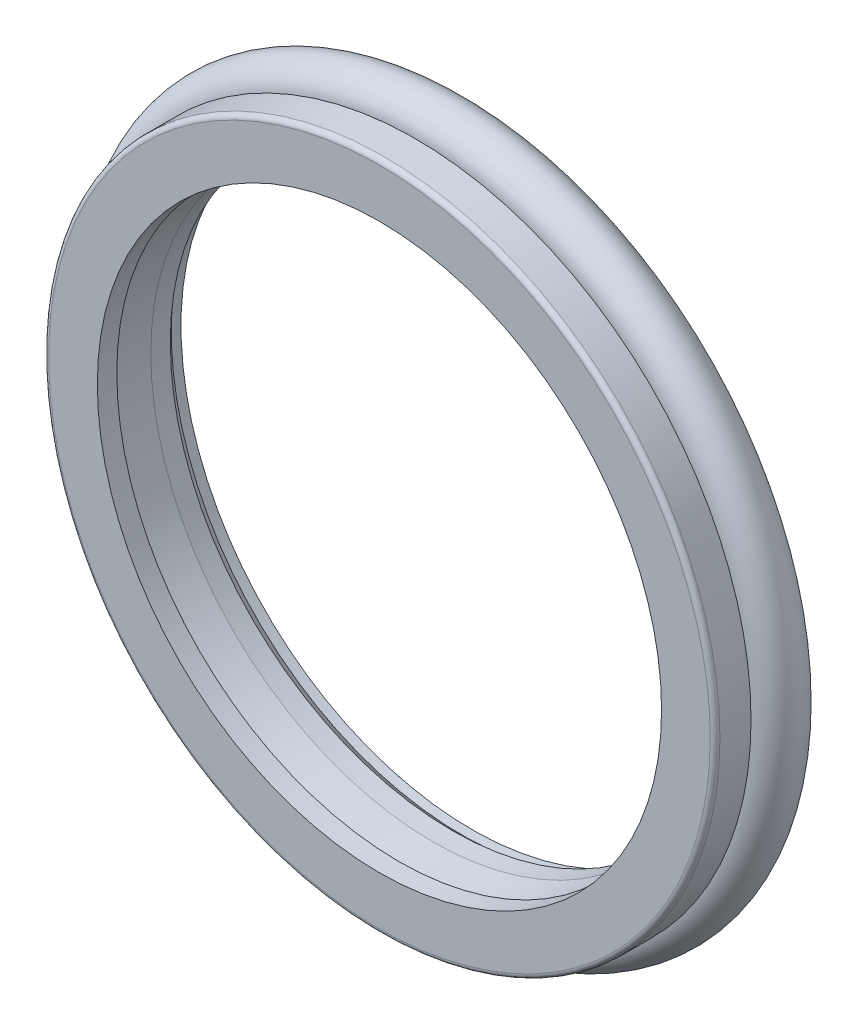
ISO-10303-21;
HEADER;
FILE_DESCRIPTION(('STEP AP214'),'2;1');
FILE_NAME('part.step','',(''),(''),'','','');
FILE_SCHEMA(('AUTOMOTIVE_DESIGN { 1 0 10303 214 1 1 1 1 }'));
ENDSEC;
DATA;
#1=APPLICATION_CONTEXT('core data for automotive mechanical design processes');
#2=APPLICATION_PROTOCOL_DEFINITION('international standard','automotive_design',2000,#1);
#3=PRODUCT_CONTEXT('',#1,'mechanical');
#4=PRODUCT('Part','Part','',(#3));
#5=PRODUCT_RELATED_PRODUCT_CATEGORY('part','',(#4));
#6=PRODUCT_DEFINITION_FORMATION('','',#4);
#7=PRODUCT_DEFINITION_CONTEXT('part definition',#1,'design');
#8=PRODUCT_DEFINITION('design','',#6,#7);
#9=PRODUCT_DEFINITION_SHAPE('','',#8);
#10=(LENGTH_UNIT() NAMED_UNIT(*) SI_UNIT(.MILLI.,.METRE.));
#11=(NAMED_UNIT(*) PLANE_ANGLE_UNIT() SI_UNIT($,.RADIAN.));
#12=(NAMED_UNIT(*) SI_UNIT($,.STERADIAN.) SOLID_ANGLE_UNIT());
#13=UNCERTAINTY_MEASURE_WITH_UNIT(LENGTH_MEASURE(1.E-05),#10,'distance_accuracy_value','');
#14=(GEOMETRIC_REPRESENTATION_CONTEXT(3) GLOBAL_UNCERTAINTY_ASSIGNED_CONTEXT((#13)) GLOBAL_UNIT_ASSIGNED_CONTEXT((#10,
#11,#12)) REPRESENTATION_CONTEXT('',''));
#15=CARTESIAN_POINT('',(0.,0.,0.));
#16=DIRECTION('',(0.,0.,1.));
#17=DIRECTION('',(1.,0.,0.));
#18=AXIS2_PLACEMENT_3D('',#15,#16,#17);
#19=CARTESIAN_POINT('',(0.,0.,-3.3));
#20=DIRECTION('',(0.,0.,1.));
#21=DIRECTION('',(1.,0.,0.));
#22=AXIS2_PLACEMENT_3D('',#19,#20,#21);
#23=TOROIDAL_SURFACE('',#22,17.05,1.3);
#24=CARTESIAN_POINT('',(18.35,0.,-3.3));
#25=VERTEX_POINT('',#24);
#26=VERTEX_LOOP('',#25);
#27=FACE_BOUND('',#26,.T.);
#28=ADVANCED_FACE('F47',(#27),#23,.T.);
#29=CLOSED_SHELL('',(#28));
#30=MANIFOLD_SOLID_BREP('B2',#29);
#31=CARTESIAN_POINT('',(0.,0.,0.));
#32=DIRECTION('',(0.,0.,1.));
#33=DIRECTION('',(1.,0.,0.));
#34=AXIS2_PLACEMENT_3D('',#31,#32,#33);
#35=CYLINDRICAL_SURFACE('',#34,14.5);
#36=CARTESIAN_POINT('',(0.,0.,-1.));
#37=DIRECTION('',(0.,0.,1.));
#38=DIRECTION('',(1.,0.,0.));
#39=AXIS2_PLACEMENT_3D('',#36,#37,#38);
#40=CIRCLE('',#39,14.5);
#41=CARTESIAN_POINT('',(14.5,0.,-1.));
#42=VERTEX_POINT('',#41);
#43=EDGE_CURVE('E46',#42,#42,#40,.T.);
#44=ORIENTED_EDGE('',*,*,#43,.F.);
#45=EDGE_LOOP('',(#44));
#46=FACE_BOUND('',#45,.T.);
#47=CARTESIAN_POINT('',(0.,0.,0.));
#48=DIRECTION('',(0.,0.,1.));
#49=DIRECTION('',(1.,0.,0.));
#50=AXIS2_PLACEMENT_3D('',#47,#48,#49);
#51=CIRCLE('',#50,14.5);
#52=CARTESIAN_POINT('',(14.5,0.,0.));
#53=VERTEX_POINT('',#52);
#54=EDGE_CURVE('E104',#53,#53,#51,.T.);
#55=ORIENTED_EDGE('',*,*,#54,.T.);
#56=EDGE_LOOP('',(#55));
#57=FACE_BOUND('',#56,.T.);
#58=ADVANCED_FACE('F64',(#46,#57),#35,.F.);
#59=CARTESIAN_POINT('',(0.,14.7,-1.));
#60=DIRECTION('',(0.,0.,1.));
#61=DIRECTION('',(1.,0.,0.));
#62=AXIS2_PLACEMENT_3D('',#59,#60,#61);
#63=PLANE('',#62);
#64=CARTESIAN_POINT('',(0.,0.,-1.));
#65=DIRECTION('',(0.,0.,1.));
#66=DIRECTION('',(1.,0.,0.));
#67=AXIS2_PLACEMENT_3D('',#64,#65,#66);
#68=CIRCLE('',#67,14.7);
#69=CARTESIAN_POINT('',(14.7,0.,-1.));
#70=VERTEX_POINT('',#69);
#71=EDGE_CURVE('E70',#70,#70,#68,.T.);
#72=ORIENTED_EDGE('',*,*,#71,.F.);
#73=EDGE_LOOP('',(#72));
#74=FACE_BOUND('',#73,.T.);
#75=ORIENTED_EDGE('',*,*,#43,.T.);
#76=EDGE_LOOP('',(#75));
#77=FACE_BOUND('',#76,.T.);
#78=ADVANCED_FACE('F165',(#74,#77),#63,.F.);
#79=CARTESIAN_POINT('',(0.,0.,-1.));
#80=DIRECTION('',(0.,0.,1.));
#81=DIRECTION('',(1.,0.,0.));
#82=AXIS2_PLACEMENT_3D('',#79,#80,#81);
#83=CONICAL_SURFACE('',#82,14.7,0.113792007143709);
#84=CARTESIAN_POINT('',(0.,0.,-2.75));
#85=DIRECTION('',(0.,0.,1.));
#86=DIRECTION('',(1.,0.,0.));
#87=AXIS2_PLACEMENT_3D('',#84,#85,#86);
#88=CIRCLE('',#87,14.5);
#89=CARTESIAN_POINT('',(14.5,0.,-2.75));
#90=VERTEX_POINT('',#89);
#91=EDGE_CURVE('E74',#90,#90,#88,.T.);
#92=ORIENTED_EDGE('',*,*,#91,.F.);
#93=EDGE_LOOP('',(#92));
#94=FACE_BOUND('',#93,.T.);
#95=ORIENTED_EDGE('',*,*,#71,.T.);
#96=EDGE_LOOP('',(#95));
#97=FACE_BOUND('',#96,.T.);
#98=ADVANCED_FACE('F160',(#94,#97),#83,.F.);
#99=CARTESIAN_POINT('',(0.,0.,0.));
#100=DIRECTION('',(0.,0.,1.));
#101=DIRECTION('',(1.,0.,0.));
#102=AXIS2_PLACEMENT_3D('',#99,#100,#101);
#103=CYLINDRICAL_SURFACE('',#102,14.5);
#104=CARTESIAN_POINT('',(0.,0.,-3.75));
#105=DIRECTION('',(0.,0.,1.));
#106=DIRECTION('',(1.,0.,0.));
#107=AXIS2_PLACEMENT_3D('',#104,#105,#106);
#108=CIRCLE('',#107,14.5);
#109=CARTESIAN_POINT('',(14.5,0.,-3.75));
#110=VERTEX_POINT('',#109);
#111=EDGE_CURVE('E78',#110,#110,#108,.T.);
#112=ORIENTED_EDGE('',*,*,#111,.F.);
#113=EDGE_LOOP('',(#112));
#114=FACE_BOUND('',#113,.T.);
#115=ORIENTED_EDGE('',*,*,#91,.T.);
#116=EDGE_LOOP('',(#115));
#117=FACE_BOUND('',#116,.T.);
#118=ADVANCED_FACE('F154',(#114,#117),#103,.F.);
#119=CARTESIAN_POINT('',(0.,0.,-3.75));
#120=DIRECTION('',(0.,0.,-1.));
#121=DIRECTION('',(-1.,0.,0.));
#122=AXIS2_PLACEMENT_3D('',#119,#120,#121);
#123=CONICAL_SURFACE('',#122,14.5,0.732815101786505);
#124=CARTESIAN_POINT('',(0.,0.,-4.25));
#125=DIRECTION('',(0.,0.,1.));
#126=DIRECTION('',(1.,0.,0.));
#127=AXIS2_PLACEMENT_3D('',#124,#125,#126);
#128=CIRCLE('',#127,14.95);
#129=CARTESIAN_POINT('',(14.95,0.,-4.25));
#130=VERTEX_POINT('',#129);
#131=EDGE_CURVE('E83',#130,#130,#128,.T.);
#132=ORIENTED_EDGE('',*,*,#131,.F.);
#133=EDGE_LOOP('',(#132));
#134=FACE_BOUND('',#133,.T.);
#135=ORIENTED_EDGE('',*,*,#111,.T.);
#136=EDGE_LOOP('',(#135));
#137=FACE_BOUND('',#136,.T.);
#138=ADVANCED_FACE('F148',(#134,#137),#123,.F.);
#139=CARTESIAN_POINT('',(0.,0.,0.));
#140=DIRECTION('',(0.,0.,1.));
#141=DIRECTION('',(1.,0.,0.));
#142=AXIS2_PLACEMENT_3D('',#139,#140,#141);
#143=CYLINDRICAL_SURFACE('',#142,14.95);
#144=CARTESIAN_POINT('',(0.,0.,-4.75));
#145=DIRECTION('',(0.,0.,1.));
#146=DIRECTION('',(1.,0.,0.));
#147=AXIS2_PLACEMENT_3D('',#144,#145,#146);
#148=CIRCLE('',#147,14.95);
#149=CARTESIAN_POINT('',(14.95,0.,-4.75));
#150=VERTEX_POINT('',#149);
#151=EDGE_CURVE('E86',#150,#150,#148,.T.);
#152=ORIENTED_EDGE('',*,*,#151,.F.);
#153=EDGE_LOOP('',(#152));
#154=FACE_BOUND('',#153,.T.);
#155=ORIENTED_EDGE('',*,*,#131,.T.);
#156=EDGE_LOOP('',(#155));
#157=FACE_BOUND('',#156,.T.);
#158=ADVANCED_FACE('F142',(#154,#157),#143,.F.);
#159=CARTESIAN_POINT('',(0.,15.75,-4.75));
#160=DIRECTION('',(0.,0.,1.));
#161=DIRECTION('',(1.,0.,0.));
#162=AXIS2_PLACEMENT_3D('',#159,#160,#161);
#163=PLANE('',#162);
#164=CARTESIAN_POINT('',(0.,0.,-4.75));
#165=DIRECTION('',(0.,0.,1.));
#166=DIRECTION('',(1.,0.,0.));
#167=AXIS2_PLACEMENT_3D('',#164,#165,#166);
#168=CIRCLE('',#167,15.75);
#169=CARTESIAN_POINT('',(15.75,0.,-4.75));
#170=VERTEX_POINT('',#169);
#171=EDGE_CURVE('E89',#170,#170,#168,.T.);
#172=ORIENTED_EDGE('',*,*,#171,.F.);
#173=EDGE_LOOP('',(#172));
#174=FACE_BOUND('',#173,.T.);
#175=ORIENTED_EDGE('',*,*,#151,.T.);
#176=EDGE_LOOP('',(#175));
#177=FACE_BOUND('',#176,.T.);
#178=ADVANCED_FACE('F136',(#174,#177),#163,.F.);
#179=CARTESIAN_POINT('',(0.,0.,0.));
#180=DIRECTION('',(0.,0.,1.));
#181=DIRECTION('',(1.,0.,0.));
#182=AXIS2_PLACEMENT_3D('',#179,#180,#181);
#183=CYLINDRICAL_SURFACE('',#182,15.75);
#184=CARTESIAN_POINT('',(0.,0.,-1.85));
#185=DIRECTION('',(0.,0.,1.));
#186=DIRECTION('',(1.,0.,0.));
#187=AXIS2_PLACEMENT_3D('',#184,#185,#186);
#188=CIRCLE('',#187,15.75);
#189=CARTESIAN_POINT('',(15.75,0.,-1.85));
#190=VERTEX_POINT('',#189);
#191=EDGE_CURVE('E92',#190,#190,#188,.T.);
#192=ORIENTED_EDGE('',*,*,#191,.F.);
#193=EDGE_LOOP('',(#192));
#194=FACE_BOUND('',#193,.T.);
#195=ORIENTED_EDGE('',*,*,#171,.T.);
#196=EDGE_LOOP('',(#195));
#197=FACE_BOUND('',#196,.T.);
#198=ADVANCED_FACE('F130',(#194,#197),#183,.T.);
#199=CARTESIAN_POINT('',(0.,15.75,-1.85));
#200=DIRECTION('',(0.,0.,1.));
#201=DIRECTION('',(1.,0.,0.));
#202=AXIS2_PLACEMENT_3D('',#199,#200,#201);
#203=PLANE('',#202);
#204=CARTESIAN_POINT('',(0.,0.,-1.85));
#205=DIRECTION('',(0.,0.,1.));
#206=DIRECTION('',(1.,0.,0.));
#207=AXIS2_PLACEMENT_3D('',#204,#205,#206);
#208=CIRCLE('',#207,17.25);
#209=CARTESIAN_POINT('',(17.25,0.,-1.85));
#210=VERTEX_POINT('',#209);
#211=EDGE_CURVE('E95',#210,#210,#208,.T.);
#212=ORIENTED_EDGE('',*,*,#211,.F.);
#213=EDGE_LOOP('',(#212));
#214=FACE_BOUND('',#213,.T.);
#215=ORIENTED_EDGE('',*,*,#191,.T.);
#216=EDGE_LOOP('',(#215));
#217=FACE_BOUND('',#216,.T.);
#218=ADVANCED_FACE('F124',(#214,#217),#203,.F.);
#219=CARTESIAN_POINT('',(0.,0.,0.));
#220=DIRECTION('',(0.,0.,1.));
#221=DIRECTION('',(1.,0.,0.));
#222=AXIS2_PLACEMENT_3D('',#219,#220,#221);
#223=CYLINDRICAL_SURFACE('',#222,17.25);
#224=CARTESIAN_POINT('',(0.,0.,-0.25));
#225=DIRECTION('',(0.,0.,1.));
#226=DIRECTION('',(1.,0.,0.));
#227=AXIS2_PLACEMENT_3D('',#224,#225,#226);
#228=CIRCLE('',#227,17.25);
#229=CARTESIAN_POINT('',(17.25,0.,-0.25));
#230=VERTEX_POINT('',#229);
#231=EDGE_CURVE('E98',#230,#230,#228,.T.);
#232=ORIENTED_EDGE('',*,*,#231,.F.);
#233=EDGE_LOOP('',(#232));
#234=FACE_BOUND('',#233,.T.);
#235=ORIENTED_EDGE('',*,*,#211,.T.);
#236=EDGE_LOOP('',(#235));
#237=FACE_BOUND('',#236,.T.);
#238=ADVANCED_FACE('F118',(#234,#237),#223,.T.);
#239=CARTESIAN_POINT('',(0.,0.,-0.25));
#240=DIRECTION('',(0.,0.,1.));
#241=DIRECTION('',(1.,0.,0.));
#242=AXIS2_PLACEMENT_3D('',#239,#240,#241);
#243=TOROIDAL_SURFACE('',#242,17.,0.25);
#244=CARTESIAN_POINT('',(0.,0.,0.));
#245=DIRECTION('',(0.,0.,1.));
#246=DIRECTION('',(1.,0.,0.));
#247=AXIS2_PLACEMENT_3D('',#244,#245,#246);
#248=CIRCLE('',#247,17.);
#249=CARTESIAN_POINT('',(17.,0.,0.));
#250=VERTEX_POINT('',#249);
#251=EDGE_CURVE('E101',#250,#250,#248,.T.);
#252=ORIENTED_EDGE('',*,*,#251,.F.);
#253=EDGE_LOOP('',(#252));
#254=FACE_BOUND('',#253,.T.);
#255=ORIENTED_EDGE('',*,*,#231,.T.);
#256=EDGE_LOOP('',(#255));
#257=FACE_BOUND('',#256,.T.);
#258=ADVANCED_FACE('F112',(#254,#257),#243,.T.);
#259=CARTESIAN_POINT('',(0.,17.,0.));
#260=DIRECTION('',(0.,0.,-1.));
#261=DIRECTION('',(-1.,0.,0.));
#262=AXIS2_PLACEMENT_3D('',#259,#260,#261);
#263=PLANE('',#262);
#264=ORIENTED_EDGE('',*,*,#54,.F.);
#265=EDGE_LOOP('',(#264));
#266=FACE_BOUND('',#265,.T.);
#267=ORIENTED_EDGE('',*,*,#251,.T.);
#268=EDGE_LOOP('',(#267));
#269=FACE_BOUND('',#268,.T.);
#270=ADVANCED_FACE('F109',(#266,#269),#263,.F.);
#271=CLOSED_SHELL('',(#58,#78,#98,#118,#138,#158,#178,#198,#218,#238,#258,#270));
#272=MANIFOLD_SOLID_BREP('B6',#271);
#273=ADVANCED_BREP_SHAPE_REPRESENTATION('',(#18,#30,#272),#14);
#274=SHAPE_DEFINITION_REPRESENTATION(#9,#273);
ENDSEC;
END-ISO-10303-21;
